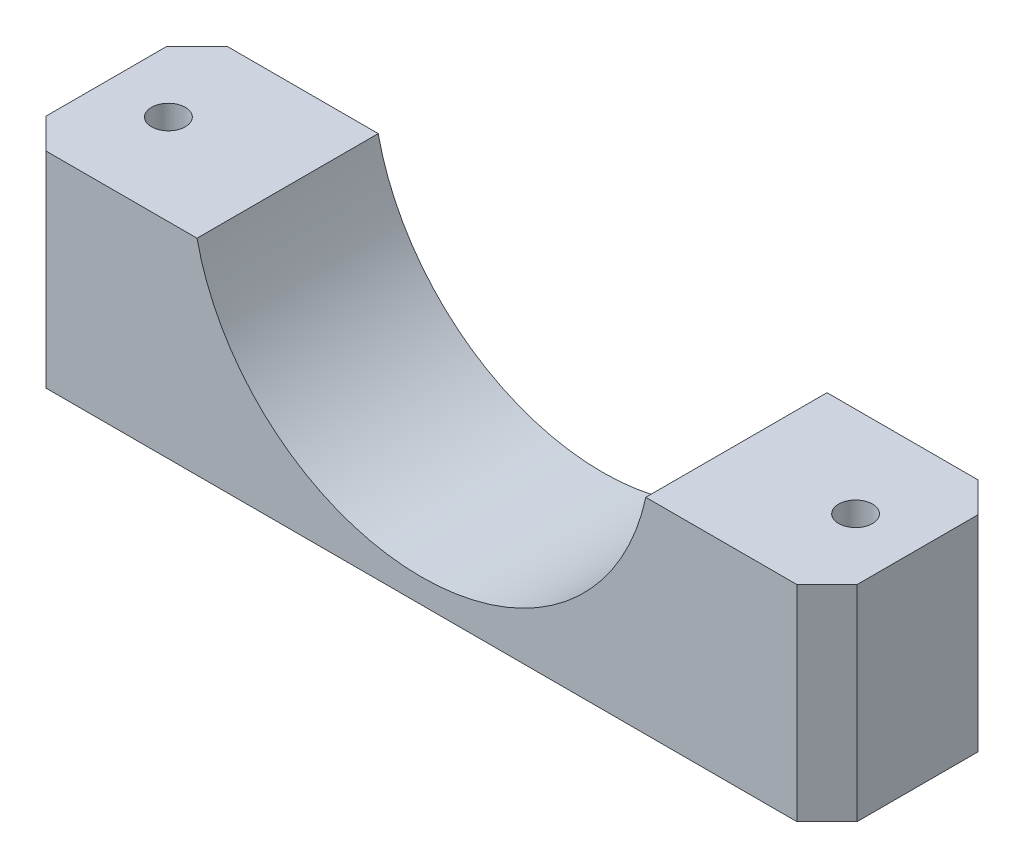
ISO-10303-21;
HEADER;
FILE_DESCRIPTION(('STEP AP214'),'2;1');
FILE_NAME('part.step','',(''),(''),'','','');
FILE_SCHEMA(('AUTOMOTIVE_DESIGN { 1 0 10303 214 1 1 1 1 }'));
ENDSEC;
DATA;
#1=APPLICATION_CONTEXT('core data for automotive mechanical design processes');
#2=APPLICATION_PROTOCOL_DEFINITION('international standard','automotive_design',2000,#1);
#3=PRODUCT_CONTEXT('',#1,'mechanical');
#4=PRODUCT('Part','Part','',(#3));
#5=PRODUCT_RELATED_PRODUCT_CATEGORY('part','',(#4));
#6=PRODUCT_DEFINITION_FORMATION('','',#4);
#7=PRODUCT_DEFINITION_CONTEXT('part definition',#1,'design');
#8=PRODUCT_DEFINITION('design','',#6,#7);
#9=PRODUCT_DEFINITION_SHAPE('','',#8);
#10=(LENGTH_UNIT() NAMED_UNIT(*) SI_UNIT(.MILLI.,.METRE.));
#11=(NAMED_UNIT(*) PLANE_ANGLE_UNIT() SI_UNIT($,.RADIAN.));
#12=(NAMED_UNIT(*) SI_UNIT($,.STERADIAN.) SOLID_ANGLE_UNIT());
#13=UNCERTAINTY_MEASURE_WITH_UNIT(LENGTH_MEASURE(1.E-05),#10,'distance_accuracy_value','');
#14=(GEOMETRIC_REPRESENTATION_CONTEXT(3) GLOBAL_UNCERTAINTY_ASSIGNED_CONTEXT((#13)) GLOBAL_UNIT_ASSIGNED_CONTEXT((#10,
#11,#12)) REPRESENTATION_CONTEXT('',''));
#15=CARTESIAN_POINT('',(0.,0.,0.));
#16=DIRECTION('',(0.,0.,1.));
#17=DIRECTION('',(1.,0.,0.));
#18=AXIS2_PLACEMENT_3D('',#15,#16,#17);
#19=CARTESIAN_POINT('',(33.5741756210067,-21.,15.));
#20=DIRECTION('',(-1.,0.,0.));
#21=DIRECTION('',(0.,0.,1.));
#22=AXIS2_PLACEMENT_3D('',#19,#20,#21);
#23=PLANE('',#22);
#24=DIRECTION('',(0.,0.,-1.));
#25=VECTOR('',#24,1.);
#26=CARTESIAN_POINT('',(33.5741756210067,-21.,15.));
#27=LINE('',#26,#25);
#28=CARTESIAN_POINT('',(33.5741756210067,-21.,12.5));
#29=VERTEX_POINT('',#28);
#30=CARTESIAN_POINT('',(33.5741756210067,-21.,2.50000000000002));
#31=VERTEX_POINT('',#30);
#32=EDGE_CURVE('E157',#29,#31,#27,.T.);
#33=ORIENTED_EDGE('',*,*,#32,.T.);
#34=DIRECTION('',(0.,1.,0.));
#35=VECTOR('',#34,1.);
#36=CARTESIAN_POINT('',(33.5741756210067,-21.,2.50000000000002));
#37=LINE('',#36,#35);
#38=CARTESIAN_POINT('',(33.5741756210067,-3.99999999999999,2.50000000000002));
#39=VERTEX_POINT('',#38);
#40=EDGE_CURVE('E177',#31,#39,#37,.T.);
#41=ORIENTED_EDGE('',*,*,#40,.T.);
#42=DIRECTION('',(0.,0.,-1.));
#43=VECTOR('',#42,1.);
#44=CARTESIAN_POINT('',(33.5741756210067,-3.99999999999999,15.));
#45=LINE('',#44,#43);
#46=CARTESIAN_POINT('',(33.5741756210067,-3.99999999999999,12.5));
#47=VERTEX_POINT('',#46);
#48=EDGE_CURVE('E145',#47,#39,#45,.T.);
#49=ORIENTED_EDGE('',*,*,#48,.F.);
#50=DIRECTION('',(0.,-1.,0.));
#51=VECTOR('',#50,1.);
#52=CARTESIAN_POINT('',(33.5741756210067,-21.,12.5));
#53=LINE('',#52,#51);
#54=EDGE_CURVE('E175',#47,#29,#53,.T.);
#55=ORIENTED_EDGE('',*,*,#54,.T.);
#56=EDGE_LOOP('',(#33,#41,#49,#55));
#57=FACE_BOUND('',#56,.T.);
#58=ADVANCED_FACE('F45',(#57),#23,.F.);
#59=CARTESIAN_POINT('',(33.5741756210067,-3.99999999999999,15.));
#60=DIRECTION('',(0.,-1.,0.));
#61=DIRECTION('',(1.,0.,0.));
#62=AXIS2_PLACEMENT_3D('',#59,#60,#61);
#63=PLANE('',#62);
#64=CARTESIAN_POINT('',(28.4416172615433,-4.,7.50000000000003));
#65=DIRECTION('',(0.,1.,0.));
#66=DIRECTION('',(-1.,0.,0.));
#67=AXIS2_PLACEMENT_3D('',#64,#65,#66);
#68=CIRCLE('',#67,1.4);
#69=CARTESIAN_POINT('',(27.0416172615434,-4.,7.50000000000003));
#70=VERTEX_POINT('',#69);
#71=EDGE_CURVE('E285',#70,#70,#68,.T.);
#72=ORIENTED_EDGE('',*,*,#71,.F.);
#73=EDGE_LOOP('',(#72));
#74=FACE_BOUND('',#73,.T.);
#75=ORIENTED_EDGE('',*,*,#48,.T.);
#76=DIRECTION('',(0.707106781186548,0.,0.707106781186547));
#77=VECTOR('',#76,1.);
#78=CARTESIAN_POINT('',(33.5741756210067,-3.99999999999999,2.50000000000001));
#79=LINE('',#78,#77);
#80=CARTESIAN_POINT('',(31.0741756210067,-4.,0.));
#81=VERTEX_POINT('',#80);
#82=EDGE_CURVE('E182',#39,#81,#79,.F.);
#83=ORIENTED_EDGE('',*,*,#82,.T.);
#84=DIRECTION('',(-1.,0.,0.));
#85=VECTOR('',#84,1.);
#86=CARTESIAN_POINT('',(33.5741756210067,-3.99999999999999,0.));
#87=LINE('',#86,#85);
#88=CARTESIAN_POINT('',(18.5741756210067,-4.,0.));
#89=VERTEX_POINT('',#88);
#90=EDGE_CURVE('E141',#81,#89,#87,.T.);
#91=ORIENTED_EDGE('',*,*,#90,.T.);
#92=DIRECTION('',(0.,0.,-1.));
#93=VECTOR('',#92,1.);
#94=CARTESIAN_POINT('',(18.5741756210067,-4.,15.));
#95=LINE('',#94,#93);
#96=CARTESIAN_POINT('',(18.5741756210067,-4.,15.));
#97=VERTEX_POINT('',#96);
#98=EDGE_CURVE('E137',#97,#89,#95,.T.);
#99=ORIENTED_EDGE('',*,*,#98,.F.);
#100=DIRECTION('',(-1.,0.,0.));
#101=VECTOR('',#100,1.);
#102=CARTESIAN_POINT('',(33.5741756210067,-3.99999999999999,15.));
#103=LINE('',#102,#101);
#104=CARTESIAN_POINT('',(31.0741756210067,-4.,15.));
#105=VERTEX_POINT('',#104);
#106=EDGE_CURVE('E124',#105,#97,#103,.T.);
#107=ORIENTED_EDGE('',*,*,#106,.F.);
#108=DIRECTION('',(0.707106781186548,0.,-0.707106781186548));
#109=VECTOR('',#108,1.);
#110=CARTESIAN_POINT('',(31.0741756210067,-4.,15.));
#111=LINE('',#110,#109);
#112=EDGE_CURVE('E180',#105,#47,#111,.T.);
#113=ORIENTED_EDGE('',*,*,#112,.T.);
#114=EDGE_LOOP('',(#75,#83,#91,#99,#107,#113));
#115=FACE_BOUND('',#114,.T.);
#116=ADVANCED_FACE('F139',(#74,#115),#63,.F.);
#117=CARTESIAN_POINT('',(0.,0.,15.));
#118=DIRECTION('',(0.,0.,-1.));
#119=DIRECTION('',(-1.,0.,0.));
#120=AXIS2_PLACEMENT_3D('',#117,#118,#119);
#121=CYLINDRICAL_SURFACE('',#120,19.);
#122=CARTESIAN_POINT('',(0.,0.,0.));
#123=DIRECTION('',(0.,0.,1.));
#124=DIRECTION('',(1.,0.,0.));
#125=AXIS2_PLACEMENT_3D('',#122,#123,#124);
#126=CIRCLE('',#125,19.);
#127=CARTESIAN_POINT('',(-18.5741756210067,-3.99999999999999,0.));
#128=VERTEX_POINT('',#127);
#129=EDGE_CURVE('E159',#128,#89,#126,.T.);
#130=ORIENTED_EDGE('',*,*,#129,.F.);
#131=DIRECTION('',(0.,0.,-1.));
#132=VECTOR('',#131,1.);
#133=CARTESIAN_POINT('',(-18.5741756210067,-3.99999999999999,15.));
#134=LINE('',#133,#132);
#135=CARTESIAN_POINT('',(-18.5741756210067,-3.99999999999999,15.));
#136=VERTEX_POINT('',#135);
#137=EDGE_CURVE('E146',#136,#128,#134,.T.);
#138=ORIENTED_EDGE('',*,*,#137,.F.);
#139=CARTESIAN_POINT('',(0.,0.,15.));
#140=DIRECTION('',(0.,0.,1.));
#141=DIRECTION('',(1.,0.,0.));
#142=AXIS2_PLACEMENT_3D('',#139,#140,#141);
#143=CIRCLE('',#142,19.);
#144=EDGE_CURVE('E130',#136,#97,#143,.T.);
#145=ORIENTED_EDGE('',*,*,#144,.T.);
#146=ORIENTED_EDGE('',*,*,#98,.T.);
#147=EDGE_LOOP('',(#130,#138,#145,#146));
#148=FACE_BOUND('',#147,.T.);
#149=ADVANCED_FACE('F148',(#148),#121,.F.);
#150=CARTESIAN_POINT('',(-18.5741756210067,-4.,15.));
#151=DIRECTION('',(0.,-1.,0.));
#152=DIRECTION('',(1.,0.,0.));
#153=AXIS2_PLACEMENT_3D('',#150,#151,#152);
#154=PLANE('',#153);
#155=CARTESIAN_POINT('',(-28.4416172615433,-4.00000000000002,7.50000000000003));
#156=DIRECTION('',(0.,1.,0.));
#157=DIRECTION('',(1.,0.,0.));
#158=AXIS2_PLACEMENT_3D('',#155,#156,#157);
#159=CIRCLE('',#158,1.4);
#160=CARTESIAN_POINT('',(-27.0416172615434,-4.00000000000002,7.50000000000003));
#161=VERTEX_POINT('',#160);
#162=EDGE_CURVE('E286',#161,#161,#159,.T.);
#163=ORIENTED_EDGE('',*,*,#162,.F.);
#164=EDGE_LOOP('',(#163));
#165=FACE_BOUND('',#164,.T.);
#166=DIRECTION('',(-1.,0.,0.));
#167=VECTOR('',#166,1.);
#168=CARTESIAN_POINT('',(-18.5741756210067,-4.,0.));
#169=LINE('',#168,#167);
#170=CARTESIAN_POINT('',(-31.0741756210067,-4.,0.));
#171=VERTEX_POINT('',#170);
#172=EDGE_CURVE('E162',#128,#171,#169,.T.);
#173=ORIENTED_EDGE('',*,*,#172,.T.);
#174=DIRECTION('',(0.707106781186548,0.,-0.707106781186547));
#175=VECTOR('',#174,1.);
#176=CARTESIAN_POINT('',(-33.5741756210067,-4.,2.50000000000002));
#177=LINE('',#176,#175);
#178=CARTESIAN_POINT('',(-33.5741756210067,-4.,2.50000000000002));
#179=VERTEX_POINT('',#178);
#180=EDGE_CURVE('E11',#171,#179,#177,.F.);
#181=ORIENTED_EDGE('',*,*,#180,.T.);
#182=DIRECTION('',(0.,0.,-1.));
#183=VECTOR('',#182,1.);
#184=CARTESIAN_POINT('',(-33.5741756210067,-4.,15.));
#185=LINE('',#184,#183);
#186=CARTESIAN_POINT('',(-33.5741756210067,-4.,12.5));
#187=VERTEX_POINT('',#186);
#188=EDGE_CURVE('E171',#187,#179,#185,.T.);
#189=ORIENTED_EDGE('',*,*,#188,.F.);
#190=DIRECTION('',(0.707106781186548,0.,0.707106781186548));
#191=VECTOR('',#190,1.);
#192=CARTESIAN_POINT('',(-31.0741756210067,-4.,15.));
#193=LINE('',#192,#191);
#194=CARTESIAN_POINT('',(-31.0741756210067,-4.,15.));
#195=VERTEX_POINT('',#194);
#196=EDGE_CURVE('E54',#187,#195,#193,.T.);
#197=ORIENTED_EDGE('',*,*,#196,.T.);
#198=DIRECTION('',(-1.,0.,0.));
#199=VECTOR('',#198,1.);
#200=CARTESIAN_POINT('',(-18.5741756210067,-4.,15.));
#201=LINE('',#200,#199);
#202=EDGE_CURVE('E150',#136,#195,#201,.T.);
#203=ORIENTED_EDGE('',*,*,#202,.F.);
#204=ORIENTED_EDGE('',*,*,#137,.T.);
#205=EDGE_LOOP('',(#173,#181,#189,#197,#203,#204));
#206=FACE_BOUND('',#205,.T.);
#207=ADVANCED_FACE('F204',(#165,#206),#154,.F.);
#208=CARTESIAN_POINT('',(-33.5741756210067,-4.,15.));
#209=DIRECTION('',(1.,0.,0.));
#210=DIRECTION('',(0.,0.,-1.));
#211=AXIS2_PLACEMENT_3D('',#208,#209,#210);
#212=PLANE('',#211);
#213=ORIENTED_EDGE('',*,*,#188,.T.);
#214=DIRECTION('',(0.,-1.,0.));
#215=VECTOR('',#214,1.);
#216=CARTESIAN_POINT('',(-33.5741756210067,-4.,2.50000000000002));
#217=LINE('',#216,#215);
#218=CARTESIAN_POINT('',(-33.5741756210067,-21.,2.50000000000002));
#219=VERTEX_POINT('',#218);
#220=EDGE_CURVE('E201',#179,#219,#217,.T.);
#221=ORIENTED_EDGE('',*,*,#220,.T.);
#222=DIRECTION('',(0.,0.,-1.));
#223=VECTOR('',#222,1.);
#224=CARTESIAN_POINT('',(-33.5741756210067,-21.,15.));
#225=LINE('',#224,#223);
#226=CARTESIAN_POINT('',(-33.5741756210067,-21.,12.5));
#227=VERTEX_POINT('',#226);
#228=EDGE_CURVE('E168',#227,#219,#225,.T.);
#229=ORIENTED_EDGE('',*,*,#228,.F.);
#230=DIRECTION('',(0.,1.,0.));
#231=VECTOR('',#230,1.);
#232=CARTESIAN_POINT('',(-33.5741756210067,-4.,12.5));
#233=LINE('',#232,#231);
#234=EDGE_CURVE('E66',#227,#187,#233,.T.);
#235=ORIENTED_EDGE('',*,*,#234,.T.);
#236=EDGE_LOOP('',(#213,#221,#229,#235));
#237=FACE_BOUND('',#236,.T.);
#238=ADVANCED_FACE('F210',(#237),#212,.F.);
#239=CARTESIAN_POINT('',(-33.5741756210067,-21.,15.));
#240=DIRECTION('',(0.,1.,0.));
#241=DIRECTION('',(0.,0.,1.));
#242=AXIS2_PLACEMENT_3D('',#239,#240,#241);
#243=PLANE('',#242);
#244=CARTESIAN_POINT('',(28.4416172615434,-21.,7.50000000000003));
#245=DIRECTION('',(0.,1.,0.));
#246=DIRECTION('',(-1.,0.,0.));
#247=AXIS2_PLACEMENT_3D('',#244,#245,#246);
#248=CIRCLE('',#247,1.4);
#249=CARTESIAN_POINT('',(27.0416172615434,-21.,7.50000000000003));
#250=VERTEX_POINT('',#249);
#251=EDGE_CURVE('E160',#250,#250,#248,.T.);
#252=ORIENTED_EDGE('',*,*,#251,.T.);
#253=EDGE_LOOP('',(#252));
#254=FACE_BOUND('',#253,.T.);
#255=CARTESIAN_POINT('',(-28.4416172615433,-21.,7.50000000000003));
#256=DIRECTION('',(0.,1.,0.));
#257=DIRECTION('',(1.,0.,0.));
#258=AXIS2_PLACEMENT_3D('',#255,#256,#257);
#259=CIRCLE('',#258,1.4);
#260=CARTESIAN_POINT('',(-27.0416172615433,-21.,7.50000000000003));
#261=VERTEX_POINT('',#260);
#262=EDGE_CURVE('E290',#261,#261,#259,.T.);
#263=ORIENTED_EDGE('',*,*,#262,.T.);
#264=EDGE_LOOP('',(#263));
#265=FACE_BOUND('',#264,.T.);
#266=DIRECTION('',(1.,0.,0.));
#267=VECTOR('',#266,1.);
#268=CARTESIAN_POINT('',(-33.5741756210067,-21.,0.));
#269=LINE('',#268,#267);
#270=CARTESIAN_POINT('',(-31.0741756210067,-21.,0.));
#271=VERTEX_POINT('',#270);
#272=CARTESIAN_POINT('',(31.0741756210067,-21.,0.));
#273=VERTEX_POINT('',#272);
#274=EDGE_CURVE('E134',#271,#273,#269,.T.);
#275=ORIENTED_EDGE('',*,*,#274,.T.);
#276=DIRECTION('',(-0.707106781186548,0.,-0.707106781186547));
#277=VECTOR('',#276,1.);
#278=CARTESIAN_POINT('',(33.5741756210067,-21.,2.50000000000002));
#279=LINE('',#278,#277);
#280=EDGE_CURVE('E194',#273,#31,#279,.F.);
#281=ORIENTED_EDGE('',*,*,#280,.T.);
#282=ORIENTED_EDGE('',*,*,#32,.F.);
#283=DIRECTION('',(-0.707106781186548,0.,0.707106781186548));
#284=VECTOR('',#283,1.);
#285=CARTESIAN_POINT('',(31.0741756210067,-21.,15.));
#286=LINE('',#285,#284);
#287=CARTESIAN_POINT('',(31.0741756210067,-21.,15.));
#288=VERTEX_POINT('',#287);
#289=EDGE_CURVE('E192',#29,#288,#286,.T.);
#290=ORIENTED_EDGE('',*,*,#289,.T.);
#291=DIRECTION('',(1.,0.,0.));
#292=VECTOR('',#291,1.);
#293=CARTESIAN_POINT('',(-33.5741756210067,-21.,15.));
#294=LINE('',#293,#292);
#295=CARTESIAN_POINT('',(-31.0741756210067,-21.,15.));
#296=VERTEX_POINT('',#295);
#297=EDGE_CURVE('E152',#296,#288,#294,.T.);
#298=ORIENTED_EDGE('',*,*,#297,.F.);
#299=DIRECTION('',(-0.707106781186548,0.,-0.707106781186548));
#300=VECTOR('',#299,1.);
#301=CARTESIAN_POINT('',(-31.0741756210067,-21.,15.));
#302=LINE('',#301,#300);
#303=EDGE_CURVE('E188',#296,#227,#302,.T.);
#304=ORIENTED_EDGE('',*,*,#303,.T.);
#305=ORIENTED_EDGE('',*,*,#228,.T.);
#306=DIRECTION('',(-0.707106781186548,0.,0.707106781186547));
#307=VECTOR('',#306,1.);
#308=CARTESIAN_POINT('',(-33.5741756210067,-21.,2.50000000000002));
#309=LINE('',#308,#307);
#310=EDGE_CURVE('E190',#219,#271,#309,.F.);
#311=ORIENTED_EDGE('',*,*,#310,.T.);
#312=EDGE_LOOP('',(#275,#281,#282,#290,#298,#304,#305,#311));
#313=FACE_BOUND('',#312,.T.);
#314=ADVANCED_FACE('F209',(#254,#265,#313),#243,.F.);
#315=CARTESIAN_POINT('',(0.,0.,15.));
#316=DIRECTION('',(0.,0.,1.));
#317=DIRECTION('',(1.,0.,0.));
#318=AXIS2_PLACEMENT_3D('',#315,#316,#317);
#319=PLANE('',#318);
#320=ORIENTED_EDGE('',*,*,#297,.T.);
#321=DIRECTION('',(0.,1.,0.));
#322=VECTOR('',#321,1.);
#323=CARTESIAN_POINT('',(31.0741756210067,-3.99999999999999,15.));
#324=LINE('',#323,#322);
#325=EDGE_CURVE('E132',#288,#105,#324,.T.);
#326=ORIENTED_EDGE('',*,*,#325,.T.);
#327=ORIENTED_EDGE('',*,*,#106,.T.);
#328=ORIENTED_EDGE('',*,*,#144,.F.);
#329=ORIENTED_EDGE('',*,*,#202,.T.);
#330=DIRECTION('',(0.,-1.,0.));
#331=VECTOR('',#330,1.);
#332=CARTESIAN_POINT('',(-31.0741756210067,-21.,15.));
#333=LINE('',#332,#331);
#334=EDGE_CURVE('E196',#195,#296,#333,.T.);
#335=ORIENTED_EDGE('',*,*,#334,.T.);
#336=EDGE_LOOP('',(#320,#326,#327,#328,#329,#335));
#337=FACE_BOUND('',#336,.T.);
#338=ADVANCED_FACE('F127',(#337),#319,.T.);
#339=CARTESIAN_POINT('',(0.,0.,0.));
#340=DIRECTION('',(0.,0.,1.));
#341=DIRECTION('',(1.,0.,0.));
#342=AXIS2_PLACEMENT_3D('',#339,#340,#341);
#343=PLANE('',#342);
#344=ORIENTED_EDGE('',*,*,#90,.F.);
#345=DIRECTION('',(0.,-1.,0.));
#346=VECTOR('',#345,1.);
#347=CARTESIAN_POINT('',(31.0741756210067,0.,0.));
#348=LINE('',#347,#346);
#349=EDGE_CURVE('E186',#81,#273,#348,.T.);
#350=ORIENTED_EDGE('',*,*,#349,.T.);
#351=ORIENTED_EDGE('',*,*,#274,.F.);
#352=DIRECTION('',(0.,1.,0.));
#353=VECTOR('',#352,1.);
#354=CARTESIAN_POINT('',(-31.0741756210067,0.,0.));
#355=LINE('',#354,#353);
#356=EDGE_CURVE('E184',#271,#171,#355,.T.);
#357=ORIENTED_EDGE('',*,*,#356,.T.);
#358=ORIENTED_EDGE('',*,*,#172,.F.);
#359=ORIENTED_EDGE('',*,*,#129,.T.);
#360=EDGE_LOOP('',(#344,#350,#351,#357,#358,#359));
#361=FACE_BOUND('',#360,.T.);
#362=ADVANCED_FACE('F218',(#361),#343,.F.);
#363=CARTESIAN_POINT('',(33.5741756210067,-21.,2.50000000000002));
#364=DIRECTION('',(-0.707106781186547,0.,0.707106781186548));
#365=DIRECTION('',(0.,1.,0.));
#366=AXIS2_PLACEMENT_3D('',#363,#364,#365);
#367=PLANE('',#366);
#368=ORIENTED_EDGE('',*,*,#280,.F.);
#369=ORIENTED_EDGE('',*,*,#349,.F.);
#370=ORIENTED_EDGE('',*,*,#82,.F.);
#371=ORIENTED_EDGE('',*,*,#40,.F.);
#372=EDGE_LOOP('',(#368,#369,#370,#371));
#373=FACE_BOUND('',#372,.T.);
#374=ADVANCED_FACE('F222',(#373),#367,.F.);
#375=CARTESIAN_POINT('',(31.0741756210067,0.,15.));
#376=DIRECTION('',(0.707106781186547,0.,0.707106781186547));
#377=DIRECTION('',(0.,-1.,0.));
#378=AXIS2_PLACEMENT_3D('',#375,#376,#377);
#379=PLANE('',#378);
#380=ORIENTED_EDGE('',*,*,#289,.F.);
#381=ORIENTED_EDGE('',*,*,#54,.F.);
#382=ORIENTED_EDGE('',*,*,#112,.F.);
#383=ORIENTED_EDGE('',*,*,#325,.F.);
#384=EDGE_LOOP('',(#380,#381,#382,#383));
#385=FACE_BOUND('',#384,.T.);
#386=ADVANCED_FACE('F230',(#385),#379,.T.);
#387=CARTESIAN_POINT('',(-33.5741756210067,-4.,2.50000000000002));
#388=DIRECTION('',(0.707106781186547,0.,0.707106781186548));
#389=DIRECTION('',(0.,-1.,0.));
#390=AXIS2_PLACEMENT_3D('',#387,#388,#389);
#391=PLANE('',#390);
#392=ORIENTED_EDGE('',*,*,#180,.F.);
#393=ORIENTED_EDGE('',*,*,#356,.F.);
#394=ORIENTED_EDGE('',*,*,#310,.F.);
#395=ORIENTED_EDGE('',*,*,#220,.F.);
#396=EDGE_LOOP('',(#392,#393,#394,#395));
#397=FACE_BOUND('',#396,.T.);
#398=ADVANCED_FACE('F213',(#397),#391,.F.);
#399=CARTESIAN_POINT('',(-31.0741756210067,0.,15.));
#400=DIRECTION('',(-0.707106781186547,0.,0.707106781186547));
#401=DIRECTION('',(0.,1.,0.));
#402=AXIS2_PLACEMENT_3D('',#399,#400,#401);
#403=PLANE('',#402);
#404=ORIENTED_EDGE('',*,*,#196,.F.);
#405=ORIENTED_EDGE('',*,*,#234,.F.);
#406=ORIENTED_EDGE('',*,*,#303,.F.);
#407=ORIENTED_EDGE('',*,*,#334,.F.);
#408=EDGE_LOOP('',(#404,#405,#406,#407));
#409=FACE_BOUND('',#408,.T.);
#410=ADVANCED_FACE('F48',(#409),#403,.T.);
#411=CARTESIAN_POINT('',(-28.4416172615433,-21.,7.50000000000003));
#412=DIRECTION('',(0.,1.,0.));
#413=DIRECTION('',(-1.,0.,0.));
#414=AXIS2_PLACEMENT_3D('',#411,#412,#413);
#415=CYLINDRICAL_SURFACE('',#414,1.4);
#416=ORIENTED_EDGE('',*,*,#262,.F.);
#417=EDGE_LOOP('',(#416));
#418=FACE_BOUND('',#417,.T.);
#419=ORIENTED_EDGE('',*,*,#162,.T.);
#420=EDGE_LOOP('',(#419));
#421=FACE_BOUND('',#420,.T.);
#422=ADVANCED_FACE('F271',(#418,#421),#415,.F.);
#423=CARTESIAN_POINT('',(28.4416172615434,-21.,7.50000000000003));
#424=DIRECTION('',(0.,1.,0.));
#425=DIRECTION('',(-1.,0.,0.));
#426=AXIS2_PLACEMENT_3D('',#423,#424,#425);
#427=CYLINDRICAL_SURFACE('',#426,1.4);
#428=ORIENTED_EDGE('',*,*,#251,.F.);
#429=EDGE_LOOP('',(#428));
#430=FACE_BOUND('',#429,.T.);
#431=ORIENTED_EDGE('',*,*,#71,.T.);
#432=EDGE_LOOP('',(#431));
#433=FACE_BOUND('',#432,.T.);
#434=ADVANCED_FACE('F274',(#430,#433),#427,.F.);
#435=CLOSED_SHELL('',(#58,#116,#149,#207,#238,#314,#338,#362,#374,#386,#398,#410,#422,#434));
#436=MANIFOLD_SOLID_BREP('B2',#435);
#437=ADVANCED_BREP_SHAPE_REPRESENTATION('',(#18,#436),#14);
#438=SHAPE_DEFINITION_REPRESENTATION(#9,#437);
ENDSEC;
END-ISO-10303-21;
